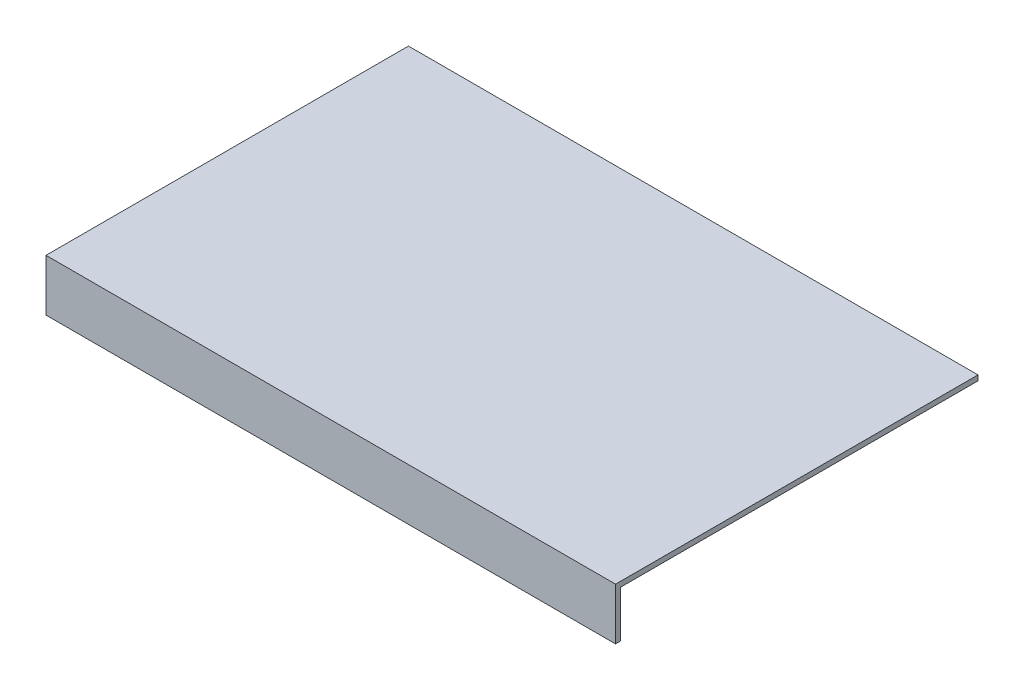
ISO-10303-21;
HEADER;
FILE_DESCRIPTION(('STEP AP214'),'2;1');
FILE_NAME('part.step','',(''),(''),'','','');
FILE_SCHEMA(('AUTOMOTIVE_DESIGN { 1 0 10303 214 1 1 1 1 }'));
ENDSEC;
DATA;
#1=APPLICATION_CONTEXT('core data for automotive mechanical design processes');
#2=APPLICATION_PROTOCOL_DEFINITION('international standard','automotive_design',2000,#1);
#3=PRODUCT_CONTEXT('',#1,'mechanical');
#4=PRODUCT('Part','Part','',(#3));
#5=PRODUCT_RELATED_PRODUCT_CATEGORY('part','',(#4));
#6=PRODUCT_DEFINITION_FORMATION('','',#4);
#7=PRODUCT_DEFINITION_CONTEXT('part definition',#1,'design');
#8=PRODUCT_DEFINITION('design','',#6,#7);
#9=PRODUCT_DEFINITION_SHAPE('','',#8);
#10=(LENGTH_UNIT() NAMED_UNIT(*) SI_UNIT(.MILLI.,.METRE.));
#11=(NAMED_UNIT(*) PLANE_ANGLE_UNIT() SI_UNIT($,.RADIAN.));
#12=(NAMED_UNIT(*) SI_UNIT($,.STERADIAN.) SOLID_ANGLE_UNIT());
#13=UNCERTAINTY_MEASURE_WITH_UNIT(LENGTH_MEASURE(1.E-05),#10,'distance_accuracy_value','');
#14=(GEOMETRIC_REPRESENTATION_CONTEXT(3) GLOBAL_UNCERTAINTY_ASSIGNED_CONTEXT((#13)) GLOBAL_UNIT_ASSIGNED_CONTEXT((#10,
#11,#12)) REPRESENTATION_CONTEXT('',''));
#15=CARTESIAN_POINT('',(0.,0.,0.));
#16=DIRECTION('',(0.,0.,1.));
#17=DIRECTION('',(1.,0.,0.));
#18=AXIS2_PLACEMENT_3D('',#15,#16,#17);
#19=CARTESIAN_POINT('',(0.,25.4,203.2));
#20=DIRECTION('',(0.,0.,-1.));
#21=DIRECTION('',(-1.,0.,0.));
#22=AXIS2_PLACEMENT_3D('',#19,#20,#21);
#23=PLANE('',#22);
#24=DIRECTION('',(0.,1.,0.));
#25=VECTOR('',#24,1.);
#26=CARTESIAN_POINT('',(0.,0.,203.2));
#27=LINE('',#26,#25);
#28=CARTESIAN_POINT('',(0.,0.,203.2));
#29=VERTEX_POINT('',#28);
#30=CARTESIAN_POINT('',(0.,25.4,203.2));
#31=VERTEX_POINT('',#30);
#32=EDGE_CURVE('E99',#29,#31,#27,.T.);
#33=ORIENTED_EDGE('',*,*,#32,.T.);
#34=DIRECTION('',(1.,0.,0.));
#35=VECTOR('',#34,1.);
#36=CARTESIAN_POINT('',(0.,25.4,203.2));
#37=LINE('',#36,#35);
#38=CARTESIAN_POINT('',(-279.4,25.4,203.2));
#39=VERTEX_POINT('',#38);
#40=EDGE_CURVE('E131',#39,#31,#37,.T.);
#41=ORIENTED_EDGE('',*,*,#40,.F.);
#42=DIRECTION('',(0.,-1.,0.));
#43=VECTOR('',#42,1.);
#44=CARTESIAN_POINT('',(-279.4,25.4,203.2));
#45=LINE('',#44,#43);
#46=CARTESIAN_POINT('',(-279.4,0.,203.2));
#47=VERTEX_POINT('',#46);
#48=EDGE_CURVE('E64',#39,#47,#45,.T.);
#49=ORIENTED_EDGE('',*,*,#48,.T.);
#50=DIRECTION('',(1.,0.,0.));
#51=VECTOR('',#50,1.);
#52=CARTESIAN_POINT('',(0.,0.,203.2));
#53=LINE('',#52,#51);
#54=EDGE_CURVE('E118',#47,#29,#53,.T.);
#55=ORIENTED_EDGE('',*,*,#54,.T.);
#56=EDGE_LOOP('',(#33,#41,#49,#55));
#57=FACE_BOUND('',#56,.T.);
#58=ADVANCED_FACE('F40',(#57),#23,.F.);
#59=CARTESIAN_POINT('',(0.,25.4,0.));
#60=DIRECTION('',(0.,1.,0.));
#61=DIRECTION('',(0.,0.,1.));
#62=AXIS2_PLACEMENT_3D('',#59,#60,#61);
#63=PLANE('',#62);
#64=ORIENTED_EDGE('',*,*,#40,.T.);
#65=DIRECTION('',(0.,0.,-1.));
#66=VECTOR('',#65,1.);
#67=CARTESIAN_POINT('',(0.,25.4,0.));
#68=LINE('',#67,#66);
#69=CARTESIAN_POINT('',(0.,25.4,25.4));
#70=VERTEX_POINT('',#69);
#71=EDGE_CURVE('E105',#31,#70,#68,.T.);
#72=ORIENTED_EDGE('',*,*,#71,.T.);
#73=DIRECTION('',(1.,0.,0.));
#74=VECTOR('',#73,1.);
#75=CARTESIAN_POINT('',(0.,25.4,25.4));
#76=LINE('',#75,#74);
#77=CARTESIAN_POINT('',(-279.4,25.4,25.4));
#78=VERTEX_POINT('',#77);
#79=EDGE_CURVE('E123',#78,#70,#76,.T.);
#80=ORIENTED_EDGE('',*,*,#79,.F.);
#81=DIRECTION('',(0.,0.,-1.));
#82=VECTOR('',#81,1.);
#83=CARTESIAN_POINT('',(-279.4,25.4,0.));
#84=LINE('',#83,#82);
#85=EDGE_CURVE('E126',#39,#78,#84,.T.);
#86=ORIENTED_EDGE('',*,*,#85,.F.);
#87=EDGE_LOOP('',(#64,#72,#80,#86));
#88=FACE_BOUND('',#87,.T.);
#89=ADVANCED_FACE('F178',(#88),#63,.T.);
#90=CARTESIAN_POINT('',(0.,0.,0.));
#91=DIRECTION('',(0.,1.,0.));
#92=DIRECTION('',(0.,0.,1.));
#93=AXIS2_PLACEMENT_3D('',#90,#91,#92);
#94=PLANE('',#93);
#95=DIRECTION('',(0.,0.,-1.));
#96=VECTOR('',#95,1.);
#97=CARTESIAN_POINT('',(0.,0.,0.));
#98=LINE('',#97,#96);
#99=CARTESIAN_POINT('',(0.,0.,200.66));
#100=VERTEX_POINT('',#99);
#101=EDGE_CURVE('E102',#29,#100,#98,.T.);
#102=ORIENTED_EDGE('',*,*,#101,.F.);
#103=ORIENTED_EDGE('',*,*,#54,.F.);
#104=DIRECTION('',(0.,0.,-1.));
#105=VECTOR('',#104,1.);
#106=CARTESIAN_POINT('',(-279.4,0.,0.));
#107=LINE('',#106,#105);
#108=CARTESIAN_POINT('',(-279.4,0.,25.4));
#109=VERTEX_POINT('',#108);
#110=EDGE_CURVE('E127',#47,#109,#107,.T.);
#111=ORIENTED_EDGE('',*,*,#110,.T.);
#112=DIRECTION('',(1.,0.,0.));
#113=VECTOR('',#112,1.);
#114=CARTESIAN_POINT('',(0.,0.,25.4));
#115=LINE('',#114,#113);
#116=CARTESIAN_POINT('',(-276.86,0.,25.4));
#117=VERTEX_POINT('',#116);
#118=EDGE_CURVE('E111',#109,#117,#115,.T.);
#119=ORIENTED_EDGE('',*,*,#118,.T.);
#120=DIRECTION('',(0.,0.,-1.));
#121=VECTOR('',#120,1.);
#122=CARTESIAN_POINT('',(-276.86,0.,0.));
#123=LINE('',#122,#121);
#124=CARTESIAN_POINT('',(-276.86,0.,200.66));
#125=VERTEX_POINT('',#124);
#126=EDGE_CURVE('E155',#125,#117,#123,.T.);
#127=ORIENTED_EDGE('',*,*,#126,.F.);
#128=DIRECTION('',(1.,0.,0.));
#129=VECTOR('',#128,1.);
#130=CARTESIAN_POINT('',(0.,0.,200.66));
#131=LINE('',#130,#129);
#132=EDGE_CURVE('E121',#125,#100,#131,.T.);
#133=ORIENTED_EDGE('',*,*,#132,.T.);
#134=EDGE_LOOP('',(#102,#103,#111,#119,#127,#133));
#135=FACE_BOUND('',#134,.T.);
#136=ADVANCED_FACE('F116',(#135),#94,.F.);
#137=CARTESIAN_POINT('',(0.,25.4,200.66));
#138=DIRECTION('',(0.,0.,-1.));
#139=DIRECTION('',(-1.,0.,0.));
#140=AXIS2_PLACEMENT_3D('',#137,#138,#139);
#141=PLANE('',#140);
#142=DIRECTION('',(1.,0.,0.));
#143=VECTOR('',#142,1.);
#144=CARTESIAN_POINT('',(0.,22.86,200.66));
#145=LINE('',#144,#143);
#146=CARTESIAN_POINT('',(-276.86,22.86,200.66));
#147=VERTEX_POINT('',#146);
#148=CARTESIAN_POINT('',(0.,22.86,200.66));
#149=VERTEX_POINT('',#148);
#150=EDGE_CURVE('E167',#147,#149,#145,.T.);
#151=ORIENTED_EDGE('',*,*,#150,.T.);
#152=DIRECTION('',(0.,-1.,0.));
#153=VECTOR('',#152,1.);
#154=CARTESIAN_POINT('',(0.,25.4,200.66));
#155=LINE('',#154,#153);
#156=EDGE_CURVE('E157',#149,#100,#155,.T.);
#157=ORIENTED_EDGE('',*,*,#156,.T.);
#158=ORIENTED_EDGE('',*,*,#132,.F.);
#159=DIRECTION('',(0.,-1.,0.));
#160=VECTOR('',#159,1.);
#161=CARTESIAN_POINT('',(-276.86,25.4,200.66));
#162=LINE('',#161,#160);
#163=EDGE_CURVE('E133',#147,#125,#162,.T.);
#164=ORIENTED_EDGE('',*,*,#163,.F.);
#165=EDGE_LOOP('',(#151,#157,#158,#164));
#166=FACE_BOUND('',#165,.T.);
#167=ADVANCED_FACE('F194',(#166),#141,.T.);
#168=CARTESIAN_POINT('',(0.,22.86,0.));
#169=DIRECTION('',(0.,1.,0.));
#170=DIRECTION('',(0.,0.,1.));
#171=AXIS2_PLACEMENT_3D('',#168,#169,#170);
#172=PLANE('',#171);
#173=DIRECTION('',(0.,0.,-1.));
#174=VECTOR('',#173,1.);
#175=CARTESIAN_POINT('',(0.,22.86,0.));
#176=LINE('',#175,#174);
#177=CARTESIAN_POINT('',(0.,22.86,25.4));
#178=VERTEX_POINT('',#177);
#179=EDGE_CURVE('E11',#149,#178,#176,.T.);
#180=ORIENTED_EDGE('',*,*,#179,.F.);
#181=ORIENTED_EDGE('',*,*,#150,.F.);
#182=DIRECTION('',(0.,0.,-1.));
#183=VECTOR('',#182,1.);
#184=CARTESIAN_POINT('',(-276.86,22.86,0.));
#185=LINE('',#184,#183);
#186=CARTESIAN_POINT('',(-276.86,22.86,25.4));
#187=VERTEX_POINT('',#186);
#188=EDGE_CURVE('E147',#147,#187,#185,.T.);
#189=ORIENTED_EDGE('',*,*,#188,.T.);
#190=DIRECTION('',(1.,0.,0.));
#191=VECTOR('',#190,1.);
#192=CARTESIAN_POINT('',(0.,22.86,25.4));
#193=LINE('',#192,#191);
#194=EDGE_CURVE('E49',#187,#178,#193,.T.);
#195=ORIENTED_EDGE('',*,*,#194,.T.);
#196=EDGE_LOOP('',(#180,#181,#189,#195));
#197=FACE_BOUND('',#196,.T.);
#198=ADVANCED_FACE('F143',(#197),#172,.F.);
#199=CARTESIAN_POINT('',(-279.4,25.4,0.));
#200=DIRECTION('',(-1.,0.,0.));
#201=DIRECTION('',(0.,0.,1.));
#202=AXIS2_PLACEMENT_3D('',#199,#200,#201);
#203=PLANE('',#202);
#204=DIRECTION('',(0.,1.,0.));
#205=VECTOR('',#204,1.);
#206=CARTESIAN_POINT('',(-279.4,0.,25.4));
#207=LINE('',#206,#205);
#208=EDGE_CURVE('E110',#109,#78,#207,.T.);
#209=ORIENTED_EDGE('',*,*,#208,.F.);
#210=ORIENTED_EDGE('',*,*,#110,.F.);
#211=ORIENTED_EDGE('',*,*,#48,.F.);
#212=ORIENTED_EDGE('',*,*,#85,.T.);
#213=EDGE_LOOP('',(#209,#210,#211,#212));
#214=FACE_BOUND('',#213,.T.);
#215=ADVANCED_FACE('F42',(#214),#203,.T.);
#216=CARTESIAN_POINT('',(-276.86,25.4,0.));
#217=DIRECTION('',(-1.,0.,0.));
#218=DIRECTION('',(0.,0.,1.));
#219=AXIS2_PLACEMENT_3D('',#216,#217,#218);
#220=PLANE('',#219);
#221=ORIENTED_EDGE('',*,*,#126,.T.);
#222=DIRECTION('',(0.,1.,0.));
#223=VECTOR('',#222,1.);
#224=CARTESIAN_POINT('',(-276.86,25.4,25.4));
#225=LINE('',#224,#223);
#226=EDGE_CURVE('E150',#117,#187,#225,.T.);
#227=ORIENTED_EDGE('',*,*,#226,.T.);
#228=ORIENTED_EDGE('',*,*,#188,.F.);
#229=ORIENTED_EDGE('',*,*,#163,.T.);
#230=EDGE_LOOP('',(#221,#227,#228,#229));
#231=FACE_BOUND('',#230,.T.);
#232=ADVANCED_FACE('F154',(#231),#220,.F.);
#233=CARTESIAN_POINT('',(0.,0.,25.4));
#234=DIRECTION('',(0.,0.,1.));
#235=DIRECTION('',(1.,0.,0.));
#236=AXIS2_PLACEMENT_3D('',#233,#234,#235);
#237=PLANE('',#236);
#238=ORIENTED_EDGE('',*,*,#118,.F.);
#239=ORIENTED_EDGE('',*,*,#208,.T.);
#240=ORIENTED_EDGE('',*,*,#79,.T.);
#241=DIRECTION('',(0.,1.,0.));
#242=VECTOR('',#241,1.);
#243=CARTESIAN_POINT('',(0.,0.,25.4));
#244=LINE('',#243,#242);
#245=EDGE_CURVE('E56',#178,#70,#244,.T.);
#246=ORIENTED_EDGE('',*,*,#245,.F.);
#247=ORIENTED_EDGE('',*,*,#194,.F.);
#248=ORIENTED_EDGE('',*,*,#226,.F.);
#249=EDGE_LOOP('',(#238,#239,#240,#246,#247,#248));
#250=FACE_BOUND('',#249,.T.);
#251=ADVANCED_FACE('F149',(#250),#237,.F.);
#252=CARTESIAN_POINT('',(0.,0.,0.));
#253=DIRECTION('',(1.,0.,0.));
#254=DIRECTION('',(0.,0.,-1.));
#255=AXIS2_PLACEMENT_3D('',#252,#253,#254);
#256=PLANE('',#255);
#257=ORIENTED_EDGE('',*,*,#179,.T.);
#258=ORIENTED_EDGE('',*,*,#245,.T.);
#259=ORIENTED_EDGE('',*,*,#71,.F.);
#260=ORIENTED_EDGE('',*,*,#32,.F.);
#261=ORIENTED_EDGE('',*,*,#101,.T.);
#262=ORIENTED_EDGE('',*,*,#156,.F.);
#263=EDGE_LOOP('',(#257,#258,#259,#260,#261,#262));
#264=FACE_BOUND('',#263,.T.);
#265=ADVANCED_FACE('F101',(#264),#256,.T.);
#266=CLOSED_SHELL('',(#58,#89,#136,#167,#198,#215,#232,#251,#265));
#267=MANIFOLD_SOLID_BREP('B2',#266);
#268=ADVANCED_BREP_SHAPE_REPRESENTATION('',(#18,#267),#14);
#269=SHAPE_DEFINITION_REPRESENTATION(#9,#268);
ENDSEC;
END-ISO-10303-21;
